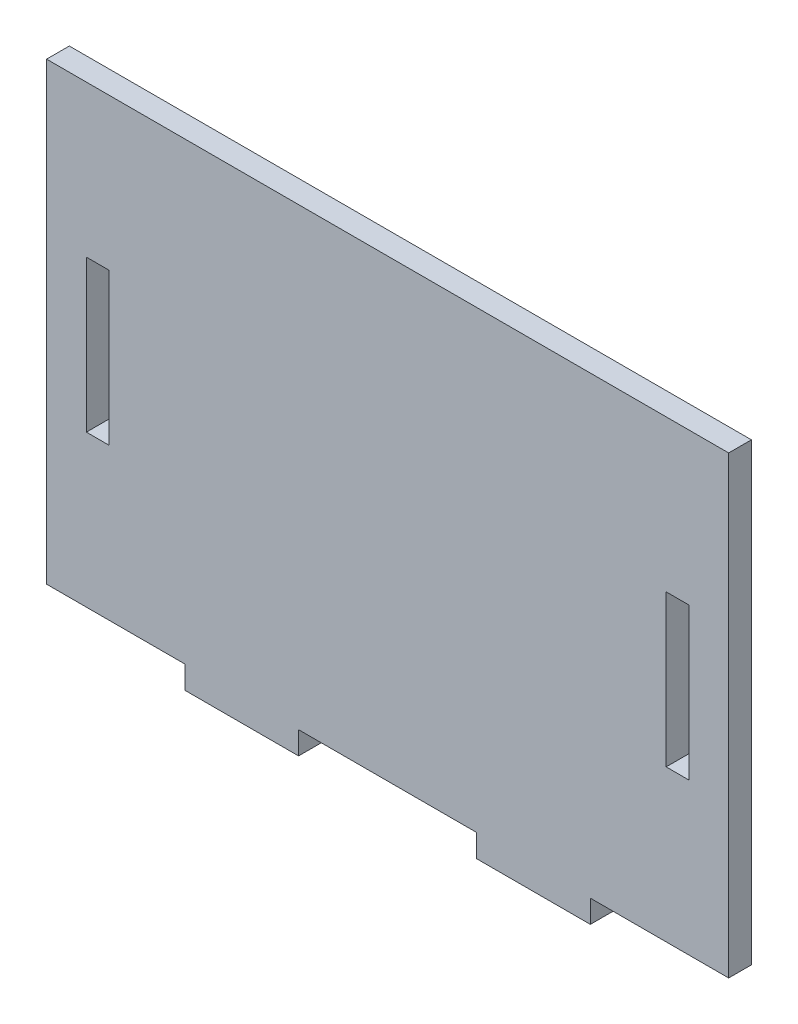
ISO-10303-21;
HEADER;
FILE_DESCRIPTION(('STEP AP214'),'2;1');
FILE_NAME('part.step','',(''),(''),'','','');
FILE_SCHEMA(('AUTOMOTIVE_DESIGN { 1 0 10303 214 1 1 1 1 }'));
ENDSEC;
DATA;
#1=APPLICATION_CONTEXT('core data for automotive mechanical design processes');
#2=APPLICATION_PROTOCOL_DEFINITION('international standard','automotive_design',2000,#1);
#3=PRODUCT_CONTEXT('',#1,'mechanical');
#4=PRODUCT('Part','Part','',(#3));
#5=PRODUCT_RELATED_PRODUCT_CATEGORY('part','',(#4));
#6=PRODUCT_DEFINITION_FORMATION('','',#4);
#7=PRODUCT_DEFINITION_CONTEXT('part definition',#1,'design');
#8=PRODUCT_DEFINITION('design','',#6,#7);
#9=PRODUCT_DEFINITION_SHAPE('','',#8);
#10=(LENGTH_UNIT() NAMED_UNIT(*) SI_UNIT(.MILLI.,.METRE.));
#11=(NAMED_UNIT(*) PLANE_ANGLE_UNIT() SI_UNIT($,.RADIAN.));
#12=(NAMED_UNIT(*) SI_UNIT($,.STERADIAN.) SOLID_ANGLE_UNIT());
#13=UNCERTAINTY_MEASURE_WITH_UNIT(LENGTH_MEASURE(1.E-05),#10,'distance_accuracy_value','');
#14=(GEOMETRIC_REPRESENTATION_CONTEXT(3) GLOBAL_UNCERTAINTY_ASSIGNED_CONTEXT((#13)) GLOBAL_UNIT_ASSIGNED_CONTEXT((#10,
#11,#12)) REPRESENTATION_CONTEXT('',''));
#15=CARTESIAN_POINT('',(0.,0.,0.));
#16=DIRECTION('',(0.,0.,1.));
#17=DIRECTION('',(1.,0.,0.));
#18=AXIS2_PLACEMENT_3D('',#15,#16,#17);
#19=CARTESIAN_POINT('',(0.,40.,3.));
#20=DIRECTION('',(0.,-1.,0.));
#21=DIRECTION('',(0.,0.,-1.));
#22=AXIS2_PLACEMENT_3D('',#19,#20,#21);
#23=PLANE('',#22);
#24=DIRECTION('',(-1.,0.,0.));
#25=VECTOR('',#24,1.);
#26=CARTESIAN_POINT('',(0.,40.,0.));
#27=LINE('',#26,#25);
#28=CARTESIAN_POINT('',(84.75,40.,0.));
#29=VERTEX_POINT('',#28);
#30=CARTESIAN_POINT('',(81.75,40.,0.));
#31=VERTEX_POINT('',#30);
#32=EDGE_CURVE('E341',#29,#31,#27,.T.);
#33=ORIENTED_EDGE('',*,*,#32,.F.);
#34=DIRECTION('',(0.,0.,-1.));
#35=VECTOR('',#34,1.);
#36=CARTESIAN_POINT('',(84.75,40.,3.));
#37=LINE('',#36,#35);
#38=CARTESIAN_POINT('',(84.75,40.,3.));
#39=VERTEX_POINT('',#38);
#40=EDGE_CURVE('E12',#39,#29,#37,.T.);
#41=ORIENTED_EDGE('',*,*,#40,.F.);
#42=DIRECTION('',(-1.,0.,0.));
#43=VECTOR('',#42,1.);
#44=CARTESIAN_POINT('',(0.,40.,3.));
#45=LINE('',#44,#43);
#46=CARTESIAN_POINT('',(81.75,40.,3.));
#47=VERTEX_POINT('',#46);
#48=EDGE_CURVE('E206',#39,#47,#45,.T.);
#49=ORIENTED_EDGE('',*,*,#48,.T.);
#50=DIRECTION('',(0.,0.,-1.));
#51=VECTOR('',#50,1.);
#52=CARTESIAN_POINT('',(81.75,40.,3.));
#53=LINE('',#52,#51);
#54=EDGE_CURVE('E66',#47,#31,#53,.T.);
#55=ORIENTED_EDGE('',*,*,#54,.T.);
#56=EDGE_LOOP('',(#33,#41,#49,#55));
#57=FACE_BOUND('',#56,.T.);
#58=ADVANCED_FACE('F46',(#57),#23,.T.);
#59=CARTESIAN_POINT('',(84.75,0.,3.));
#60=DIRECTION('',(1.,0.,0.));
#61=DIRECTION('',(0.,1.,0.));
#62=AXIS2_PLACEMENT_3D('',#59,#60,#61);
#63=PLANE('',#62);
#64=DIRECTION('',(0.,-1.,0.));
#65=VECTOR('',#64,1.);
#66=CARTESIAN_POINT('',(84.75,0.,0.));
#67=LINE('',#66,#65);
#68=CARTESIAN_POINT('',(84.75,20.,0.));
#69=VERTEX_POINT('',#68);
#70=EDGE_CURVE('E212',#29,#69,#67,.T.);
#71=ORIENTED_EDGE('',*,*,#70,.T.);
#72=DIRECTION('',(0.,0.,-1.));
#73=VECTOR('',#72,1.);
#74=CARTESIAN_POINT('',(84.75,20.,3.));
#75=LINE('',#74,#73);
#76=CARTESIAN_POINT('',(84.75,20.,3.));
#77=VERTEX_POINT('',#76);
#78=EDGE_CURVE('E57',#77,#69,#75,.T.);
#79=ORIENTED_EDGE('',*,*,#78,.F.);
#80=DIRECTION('',(0.,-1.,0.));
#81=VECTOR('',#80,1.);
#82=CARTESIAN_POINT('',(84.75,0.,3.));
#83=LINE('',#82,#81);
#84=EDGE_CURVE('E201',#39,#77,#83,.T.);
#85=ORIENTED_EDGE('',*,*,#84,.F.);
#86=ORIENTED_EDGE('',*,*,#40,.T.);
#87=EDGE_LOOP('',(#71,#79,#85,#86));
#88=FACE_BOUND('',#87,.T.);
#89=ADVANCED_FACE('F210',(#88),#63,.F.);
#90=CARTESIAN_POINT('',(0.,20.,3.));
#91=DIRECTION('',(0.,-1.,0.));
#92=DIRECTION('',(0.,0.,-1.));
#93=AXIS2_PLACEMENT_3D('',#90,#91,#92);
#94=PLANE('',#93);
#95=DIRECTION('',(-1.,0.,0.));
#96=VECTOR('',#95,1.);
#97=CARTESIAN_POINT('',(0.,20.,0.));
#98=LINE('',#97,#96);
#99=CARTESIAN_POINT('',(81.75,20.,0.));
#100=VERTEX_POINT('',#99);
#101=EDGE_CURVE('E346',#69,#100,#98,.T.);
#102=ORIENTED_EDGE('',*,*,#101,.T.);
#103=DIRECTION('',(0.,0.,-1.));
#104=VECTOR('',#103,1.);
#105=CARTESIAN_POINT('',(81.75,20.,3.));
#106=LINE('',#105,#104);
#107=CARTESIAN_POINT('',(81.75,20.,3.));
#108=VERTEX_POINT('',#107);
#109=EDGE_CURVE('E128',#108,#100,#106,.T.);
#110=ORIENTED_EDGE('',*,*,#109,.F.);
#111=DIRECTION('',(-1.,0.,0.));
#112=VECTOR('',#111,1.);
#113=CARTESIAN_POINT('',(0.,20.,3.));
#114=LINE('',#113,#112);
#115=EDGE_CURVE('E192',#77,#108,#114,.T.);
#116=ORIENTED_EDGE('',*,*,#115,.F.);
#117=ORIENTED_EDGE('',*,*,#78,.T.);
#118=EDGE_LOOP('',(#102,#110,#116,#117));
#119=FACE_BOUND('',#118,.T.);
#120=ADVANCED_FACE('F194',(#119),#94,.F.);
#121=CARTESIAN_POINT('',(0.,40.,3.));
#122=DIRECTION('',(0.,1.,0.));
#123=DIRECTION('',(0.,0.,1.));
#124=AXIS2_PLACEMENT_3D('',#121,#122,#123);
#125=PLANE('',#124);
#126=DIRECTION('',(1.,0.,0.));
#127=VECTOR('',#126,1.);
#128=CARTESIAN_POINT('',(0.,40.,0.));
#129=LINE('',#128,#127);
#130=CARTESIAN_POINT('',(5.25,40.,0.));
#131=VERTEX_POINT('',#130);
#132=CARTESIAN_POINT('',(8.25,40.,0.));
#133=VERTEX_POINT('',#132);
#134=EDGE_CURVE('E325',#131,#133,#129,.T.);
#135=ORIENTED_EDGE('',*,*,#134,.T.);
#136=DIRECTION('',(0.,0.,-1.));
#137=VECTOR('',#136,1.);
#138=CARTESIAN_POINT('',(8.25,40.,3.));
#139=LINE('',#138,#137);
#140=CARTESIAN_POINT('',(8.25,40.,3.));
#141=VERTEX_POINT('',#140);
#142=EDGE_CURVE('E228',#141,#133,#139,.T.);
#143=ORIENTED_EDGE('',*,*,#142,.F.);
#144=DIRECTION('',(1.,0.,0.));
#145=VECTOR('',#144,1.);
#146=CARTESIAN_POINT('',(0.,40.,3.));
#147=LINE('',#146,#145);
#148=CARTESIAN_POINT('',(5.25,40.,3.));
#149=VERTEX_POINT('',#148);
#150=EDGE_CURVE('E417',#149,#141,#147,.T.);
#151=ORIENTED_EDGE('',*,*,#150,.F.);
#152=DIRECTION('',(0.,0.,-1.));
#153=VECTOR('',#152,1.);
#154=CARTESIAN_POINT('',(5.25,40.,3.));
#155=LINE('',#154,#153);
#156=EDGE_CURVE('E219',#149,#131,#155,.T.);
#157=ORIENTED_EDGE('',*,*,#156,.T.);
#158=EDGE_LOOP('',(#135,#143,#151,#157));
#159=FACE_BOUND('',#158,.T.);
#160=ADVANCED_FACE('F477',(#159),#125,.F.);
#161=CARTESIAN_POINT('',(8.25,0.,3.));
#162=DIRECTION('',(1.,0.,0.));
#163=DIRECTION('',(0.,0.,-1.));
#164=AXIS2_PLACEMENT_3D('',#161,#162,#163);
#165=PLANE('',#164);
#166=DIRECTION('',(0.,-1.,0.));
#167=VECTOR('',#166,1.);
#168=CARTESIAN_POINT('',(8.25,0.,0.));
#169=LINE('',#168,#167);
#170=CARTESIAN_POINT('',(8.25,20.,0.));
#171=VERTEX_POINT('',#170);
#172=EDGE_CURVE('E329',#133,#171,#169,.T.);
#173=ORIENTED_EDGE('',*,*,#172,.T.);
#174=DIRECTION('',(0.,0.,-1.));
#175=VECTOR('',#174,1.);
#176=CARTESIAN_POINT('',(8.25,20.,3.));
#177=LINE('',#176,#175);
#178=CARTESIAN_POINT('',(8.25,20.,3.));
#179=VERTEX_POINT('',#178);
#180=EDGE_CURVE('E225',#179,#171,#177,.T.);
#181=ORIENTED_EDGE('',*,*,#180,.F.);
#182=DIRECTION('',(0.,-1.,0.));
#183=VECTOR('',#182,1.);
#184=CARTESIAN_POINT('',(8.25,0.,3.));
#185=LINE('',#184,#183);
#186=EDGE_CURVE('E422',#141,#179,#185,.T.);
#187=ORIENTED_EDGE('',*,*,#186,.F.);
#188=ORIENTED_EDGE('',*,*,#142,.T.);
#189=EDGE_LOOP('',(#173,#181,#187,#188));
#190=FACE_BOUND('',#189,.T.);
#191=ADVANCED_FACE('F473',(#190),#165,.F.);
#192=CARTESIAN_POINT('',(0.,20.,3.));
#193=DIRECTION('',(0.,1.,0.));
#194=DIRECTION('',(0.,0.,1.));
#195=AXIS2_PLACEMENT_3D('',#192,#193,#194);
#196=PLANE('',#195);
#197=DIRECTION('',(1.,0.,0.));
#198=VECTOR('',#197,1.);
#199=CARTESIAN_POINT('',(0.,20.,0.));
#200=LINE('',#199,#198);
#201=CARTESIAN_POINT('',(5.25000000000001,20.,0.));
#202=VERTEX_POINT('',#201);
#203=EDGE_CURVE('E333',#202,#171,#200,.T.);
#204=ORIENTED_EDGE('',*,*,#203,.F.);
#205=DIRECTION('',(0.,0.,-1.));
#206=VECTOR('',#205,1.);
#207=CARTESIAN_POINT('',(5.25000000000001,20.,3.));
#208=LINE('',#207,#206);
#209=CARTESIAN_POINT('',(5.25000000000001,20.,3.));
#210=VERTEX_POINT('',#209);
#211=EDGE_CURVE('E222',#210,#202,#208,.T.);
#212=ORIENTED_EDGE('',*,*,#211,.F.);
#213=DIRECTION('',(1.,0.,0.));
#214=VECTOR('',#213,1.);
#215=CARTESIAN_POINT('',(0.,20.,3.));
#216=LINE('',#215,#214);
#217=EDGE_CURVE('E426',#210,#179,#216,.T.);
#218=ORIENTED_EDGE('',*,*,#217,.T.);
#219=ORIENTED_EDGE('',*,*,#180,.T.);
#220=EDGE_LOOP('',(#204,#212,#218,#219));
#221=FACE_BOUND('',#220,.T.);
#222=ADVANCED_FACE('F470',(#221),#196,.T.);
#223=CARTESIAN_POINT('',(0.,0.,3.));
#224=DIRECTION('',(0.,1.,0.));
#225=DIRECTION('',(0.,0.,1.));
#226=AXIS2_PLACEMENT_3D('',#223,#224,#225);
#227=PLANE('',#226);
#228=DIRECTION('',(1.,0.,0.));
#229=VECTOR('',#228,1.);
#230=CARTESIAN_POINT('',(0.,0.,0.));
#231=LINE('',#230,#229);
#232=CARTESIAN_POINT('',(0.,0.,0.));
#233=VERTEX_POINT('',#232);
#234=CARTESIAN_POINT('',(18.25,0.,0.));
#235=VERTEX_POINT('',#234);
#236=EDGE_CURVE('E278',#233,#235,#231,.T.);
#237=ORIENTED_EDGE('',*,*,#236,.T.);
#238=DIRECTION('',(0.,0.,-1.));
#239=VECTOR('',#238,1.);
#240=CARTESIAN_POINT('',(18.25,0.,3.));
#241=LINE('',#240,#239);
#242=CARTESIAN_POINT('',(18.25,0.,3.));
#243=VERTEX_POINT('',#242);
#244=EDGE_CURVE('E50',#243,#235,#241,.T.);
#245=ORIENTED_EDGE('',*,*,#244,.F.);
#246=DIRECTION('',(1.,0.,0.));
#247=VECTOR('',#246,1.);
#248=CARTESIAN_POINT('',(0.,0.,3.));
#249=LINE('',#248,#247);
#250=CARTESIAN_POINT('',(0.,0.,3.));
#251=VERTEX_POINT('',#250);
#252=EDGE_CURVE('E352',#251,#243,#249,.T.);
#253=ORIENTED_EDGE('',*,*,#252,.F.);
#254=DIRECTION('',(0.,0.,-1.));
#255=VECTOR('',#254,1.);
#256=CARTESIAN_POINT('',(0.,0.,3.));
#257=LINE('',#256,#255);
#258=EDGE_CURVE('E232',#251,#233,#257,.T.);
#259=ORIENTED_EDGE('',*,*,#258,.T.);
#260=EDGE_LOOP('',(#237,#245,#253,#259));
#261=FACE_BOUND('',#260,.T.);
#262=ADVANCED_FACE('F279',(#261),#227,.F.);
#263=CARTESIAN_POINT('',(18.25,0.,3.));
#264=DIRECTION('',(1.,0.,0.));
#265=DIRECTION('',(0.,0.,-1.));
#266=AXIS2_PLACEMENT_3D('',#263,#264,#265);
#267=PLANE('',#266);
#268=DIRECTION('',(0.,-1.,0.));
#269=VECTOR('',#268,1.);
#270=CARTESIAN_POINT('',(18.25,0.,0.));
#271=LINE('',#270,#269);
#272=CARTESIAN_POINT('',(18.25,-3.00000000000001,0.));
#273=VERTEX_POINT('',#272);
#274=EDGE_CURVE('E273',#235,#273,#271,.T.);
#275=ORIENTED_EDGE('',*,*,#274,.T.);
#276=DIRECTION('',(0.,0.,-1.));
#277=VECTOR('',#276,1.);
#278=CARTESIAN_POINT('',(18.25,-3.00000000000001,3.));
#279=LINE('',#278,#277);
#280=CARTESIAN_POINT('',(18.25,-3.00000000000001,3.));
#281=VERTEX_POINT('',#280);
#282=EDGE_CURVE('E264',#281,#273,#279,.T.);
#283=ORIENTED_EDGE('',*,*,#282,.F.);
#284=DIRECTION('',(0.,-1.,0.));
#285=VECTOR('',#284,1.);
#286=CARTESIAN_POINT('',(18.25,0.,3.));
#287=LINE('',#286,#285);
#288=EDGE_CURVE('E141',#243,#281,#287,.T.);
#289=ORIENTED_EDGE('',*,*,#288,.F.);
#290=ORIENTED_EDGE('',*,*,#244,.T.);
#291=EDGE_LOOP('',(#275,#283,#289,#290));
#292=FACE_BOUND('',#291,.T.);
#293=ADVANCED_FACE('F48',(#292),#267,.F.);
#294=CARTESIAN_POINT('',(0.,-3.00000000000001,3.));
#295=DIRECTION('',(0.,-1.,0.));
#296=DIRECTION('',(1.,0.,0.));
#297=AXIS2_PLACEMENT_3D('',#294,#295,#296);
#298=PLANE('',#297);
#299=DIRECTION('',(-1.,0.,0.));
#300=VECTOR('',#299,1.);
#301=CARTESIAN_POINT('',(0.,-3.00000000000001,0.));
#302=LINE('',#301,#300);
#303=CARTESIAN_POINT('',(33.25,-3.,0.));
#304=VERTEX_POINT('',#303);
#305=EDGE_CURVE('E288',#304,#273,#302,.T.);
#306=ORIENTED_EDGE('',*,*,#305,.F.);
#307=DIRECTION('',(0.,0.,-1.));
#308=VECTOR('',#307,1.);
#309=CARTESIAN_POINT('',(33.25,-3.,3.));
#310=LINE('',#309,#308);
#311=CARTESIAN_POINT('',(33.25,-3.,3.));
#312=VERTEX_POINT('',#311);
#313=EDGE_CURVE('E262',#312,#304,#310,.T.);
#314=ORIENTED_EDGE('',*,*,#313,.F.);
#315=DIRECTION('',(-1.,0.,0.));
#316=VECTOR('',#315,1.);
#317=CARTESIAN_POINT('',(0.,-3.00000000000001,3.));
#318=LINE('',#317,#316);
#319=EDGE_CURVE('E362',#312,#281,#318,.T.);
#320=ORIENTED_EDGE('',*,*,#319,.T.);
#321=ORIENTED_EDGE('',*,*,#282,.T.);
#322=EDGE_LOOP('',(#306,#314,#320,#321));
#323=FACE_BOUND('',#322,.T.);
#324=ADVANCED_FACE('F508',(#323),#298,.T.);
#325=CARTESIAN_POINT('',(33.25,0.,3.));
#326=DIRECTION('',(1.,0.,0.));
#327=DIRECTION('',(0.,0.,-1.));
#328=AXIS2_PLACEMENT_3D('',#325,#326,#327);
#329=PLANE('',#328);
#330=DIRECTION('',(0.,-1.,0.));
#331=VECTOR('',#330,1.);
#332=CARTESIAN_POINT('',(33.25,0.,0.));
#333=LINE('',#332,#331);
#334=CARTESIAN_POINT('',(33.25,0.,0.));
#335=VERTEX_POINT('',#334);
#336=EDGE_CURVE('E295',#335,#304,#333,.T.);
#337=ORIENTED_EDGE('',*,*,#336,.F.);
#338=DIRECTION('',(0.,0.,-1.));
#339=VECTOR('',#338,1.);
#340=CARTESIAN_POINT('',(33.25,0.,3.));
#341=LINE('',#340,#339);
#342=CARTESIAN_POINT('',(33.25,0.,3.));
#343=VERTEX_POINT('',#342);
#344=EDGE_CURVE('E259',#343,#335,#341,.T.);
#345=ORIENTED_EDGE('',*,*,#344,.F.);
#346=DIRECTION('',(0.,-1.,0.));
#347=VECTOR('',#346,1.);
#348=CARTESIAN_POINT('',(33.25,0.,3.));
#349=LINE('',#348,#347);
#350=EDGE_CURVE('E370',#343,#312,#349,.T.);
#351=ORIENTED_EDGE('',*,*,#350,.T.);
#352=ORIENTED_EDGE('',*,*,#313,.T.);
#353=EDGE_LOOP('',(#337,#345,#351,#352));
#354=FACE_BOUND('',#353,.T.);
#355=ADVANCED_FACE('F506',(#354),#329,.T.);
#356=CARTESIAN_POINT('',(56.75,0.,0.));
#357=VERTEX_POINT('',#356);
#358=EDGE_CURVE('E286',#335,#357,#231,.T.);
#359=ORIENTED_EDGE('',*,*,#358,.T.);
#360=DIRECTION('',(0.,0.,-1.));
#361=VECTOR('',#360,1.);
#362=CARTESIAN_POINT('',(56.75,0.,3.));
#363=LINE('',#362,#361);
#364=CARTESIAN_POINT('',(56.75,0.,3.));
#365=VERTEX_POINT('',#364);
#366=EDGE_CURVE('E255',#365,#357,#363,.T.);
#367=ORIENTED_EDGE('',*,*,#366,.F.);
#368=EDGE_CURVE('E358',#343,#365,#249,.T.);
#369=ORIENTED_EDGE('',*,*,#368,.F.);
#370=ORIENTED_EDGE('',*,*,#344,.T.);
#371=EDGE_LOOP('',(#359,#367,#369,#370));
#372=FACE_BOUND('',#371,.T.);
#373=ADVANCED_FACE('F494',(#372),#227,.F.);
#374=CARTESIAN_POINT('',(56.75,0.,3.));
#375=DIRECTION('',(1.,0.,0.));
#376=DIRECTION('',(0.,0.,-1.));
#377=AXIS2_PLACEMENT_3D('',#374,#375,#376);
#378=PLANE('',#377);
#379=DIRECTION('',(0.,-1.,0.));
#380=VECTOR('',#379,1.);
#381=CARTESIAN_POINT('',(56.75,0.,0.));
#382=LINE('',#381,#380);
#383=CARTESIAN_POINT('',(56.75,-3.,0.));
#384=VERTEX_POINT('',#383);
#385=EDGE_CURVE('E294',#357,#384,#382,.T.);
#386=ORIENTED_EDGE('',*,*,#385,.T.);
#387=DIRECTION('',(0.,0.,-1.));
#388=VECTOR('',#387,1.);
#389=CARTESIAN_POINT('',(56.75,-3.,3.));
#390=LINE('',#389,#388);
#391=CARTESIAN_POINT('',(56.75,-3.,3.));
#392=VERTEX_POINT('',#391);
#393=EDGE_CURVE('E251',#392,#384,#390,.T.);
#394=ORIENTED_EDGE('',*,*,#393,.F.);
#395=DIRECTION('',(0.,-1.,0.));
#396=VECTOR('',#395,1.);
#397=CARTESIAN_POINT('',(56.75,0.,3.));
#398=LINE('',#397,#396);
#399=EDGE_CURVE('E369',#365,#392,#398,.T.);
#400=ORIENTED_EDGE('',*,*,#399,.F.);
#401=ORIENTED_EDGE('',*,*,#366,.T.);
#402=EDGE_LOOP('',(#386,#394,#400,#401));
#403=FACE_BOUND('',#402,.T.);
#404=ADVANCED_FACE('F501',(#403),#378,.F.);
#405=CARTESIAN_POINT('',(0.,-3.,3.));
#406=DIRECTION('',(0.,1.,0.));
#407=DIRECTION('',(0.,0.,1.));
#408=AXIS2_PLACEMENT_3D('',#405,#406,#407);
#409=PLANE('',#408);
#410=DIRECTION('',(1.,0.,0.));
#411=VECTOR('',#410,1.);
#412=CARTESIAN_POINT('',(0.,-3.,0.));
#413=LINE('',#412,#411);
#414=CARTESIAN_POINT('',(71.75,-3.,0.));
#415=VERTEX_POINT('',#414);
#416=EDGE_CURVE('E301',#384,#415,#413,.T.);
#417=ORIENTED_EDGE('',*,*,#416,.T.);
#418=DIRECTION('',(0.,0.,-1.));
#419=VECTOR('',#418,1.);
#420=CARTESIAN_POINT('',(71.75,-3.,3.));
#421=LINE('',#420,#419);
#422=CARTESIAN_POINT('',(71.75,-3.,3.));
#423=VERTEX_POINT('',#422);
#424=EDGE_CURVE('E248',#423,#415,#421,.T.);
#425=ORIENTED_EDGE('',*,*,#424,.F.);
#426=DIRECTION('',(1.,0.,0.));
#427=VECTOR('',#426,1.);
#428=CARTESIAN_POINT('',(0.,-3.,3.));
#429=LINE('',#428,#427);
#430=EDGE_CURVE('E375',#392,#423,#429,.T.);
#431=ORIENTED_EDGE('',*,*,#430,.F.);
#432=ORIENTED_EDGE('',*,*,#393,.T.);
#433=EDGE_LOOP('',(#417,#425,#431,#432));
#434=FACE_BOUND('',#433,.T.);
#435=ADVANCED_FACE('F497',(#434),#409,.F.);
#436=CARTESIAN_POINT('',(71.75,0.,3.));
#437=DIRECTION('',(1.,0.,0.));
#438=DIRECTION('',(0.,0.,-1.));
#439=AXIS2_PLACEMENT_3D('',#436,#437,#438);
#440=PLANE('',#439);
#441=DIRECTION('',(0.,-1.,0.));
#442=VECTOR('',#441,1.);
#443=CARTESIAN_POINT('',(71.75,0.,0.));
#444=LINE('',#443,#442);
#445=CARTESIAN_POINT('',(71.75,0.,0.));
#446=VERTEX_POINT('',#445);
#447=EDGE_CURVE('E292',#446,#415,#444,.T.);
#448=ORIENTED_EDGE('',*,*,#447,.F.);
#449=DIRECTION('',(0.,0.,-1.));
#450=VECTOR('',#449,1.);
#451=CARTESIAN_POINT('',(71.75,0.,3.));
#452=LINE('',#451,#450);
#453=CARTESIAN_POINT('',(71.75,0.,3.));
#454=VERTEX_POINT('',#453);
#455=EDGE_CURVE('E245',#454,#446,#452,.T.);
#456=ORIENTED_EDGE('',*,*,#455,.F.);
#457=DIRECTION('',(0.,-1.,0.));
#458=VECTOR('',#457,1.);
#459=CARTESIAN_POINT('',(71.75,0.,3.));
#460=LINE('',#459,#458);
#461=EDGE_CURVE('E367',#454,#423,#460,.T.);
#462=ORIENTED_EDGE('',*,*,#461,.T.);
#463=ORIENTED_EDGE('',*,*,#424,.T.);
#464=EDGE_LOOP('',(#448,#456,#462,#463));
#465=FACE_BOUND('',#464,.T.);
#466=ADVANCED_FACE('F492',(#465),#440,.T.);
#467=CARTESIAN_POINT('',(90.,0.,0.));
#468=VERTEX_POINT('',#467);
#469=EDGE_CURVE('E285',#446,#468,#231,.T.);
#470=ORIENTED_EDGE('',*,*,#469,.T.);
#471=DIRECTION('',(0.,0.,-1.));
#472=VECTOR('',#471,1.);
#473=CARTESIAN_POINT('',(90.,0.,3.));
#474=LINE('',#473,#472);
#475=CARTESIAN_POINT('',(90.,0.,3.));
#476=VERTEX_POINT('',#475);
#477=EDGE_CURVE('E241',#476,#468,#474,.T.);
#478=ORIENTED_EDGE('',*,*,#477,.F.);
#479=EDGE_CURVE('E357',#454,#476,#249,.T.);
#480=ORIENTED_EDGE('',*,*,#479,.F.);
#481=ORIENTED_EDGE('',*,*,#455,.T.);
#482=EDGE_LOOP('',(#470,#478,#480,#481));
#483=FACE_BOUND('',#482,.T.);
#484=ADVANCED_FACE('F488',(#483),#227,.F.);
#485=CARTESIAN_POINT('',(90.,0.,3.));
#486=DIRECTION('',(-1.,0.,0.));
#487=DIRECTION('',(0.,0.,1.));
#488=AXIS2_PLACEMENT_3D('',#485,#486,#487);
#489=PLANE('',#488);
#490=DIRECTION('',(0.,1.,0.));
#491=VECTOR('',#490,1.);
#492=CARTESIAN_POINT('',(90.,0.,0.));
#493=LINE('',#492,#491);
#494=CARTESIAN_POINT('',(90.,60.,0.));
#495=VERTEX_POINT('',#494);
#496=EDGE_CURVE('E291',#468,#495,#493,.T.);
#497=ORIENTED_EDGE('',*,*,#496,.T.);
#498=DIRECTION('',(0.,0.,-1.));
#499=VECTOR('',#498,1.);
#500=CARTESIAN_POINT('',(90.,60.,3.));
#501=LINE('',#500,#499);
#502=CARTESIAN_POINT('',(90.,60.,3.));
#503=VERTEX_POINT('',#502);
#504=EDGE_CURVE('E238',#503,#495,#501,.T.);
#505=ORIENTED_EDGE('',*,*,#504,.F.);
#506=DIRECTION('',(0.,1.,0.));
#507=VECTOR('',#506,1.);
#508=CARTESIAN_POINT('',(90.,0.,3.));
#509=LINE('',#508,#507);
#510=EDGE_CURVE('E366',#476,#503,#509,.T.);
#511=ORIENTED_EDGE('',*,*,#510,.F.);
#512=ORIENTED_EDGE('',*,*,#477,.T.);
#513=EDGE_LOOP('',(#497,#505,#511,#512));
#514=FACE_BOUND('',#513,.T.);
#515=ADVANCED_FACE('F484',(#514),#489,.F.);
#516=CARTESIAN_POINT('',(0.,60.,3.));
#517=DIRECTION('',(0.,1.,0.));
#518=DIRECTION('',(0.,0.,1.));
#519=AXIS2_PLACEMENT_3D('',#516,#517,#518);
#520=PLANE('',#519);
#521=DIRECTION('',(1.,0.,0.));
#522=VECTOR('',#521,1.);
#523=CARTESIAN_POINT('',(0.,60.,0.));
#524=LINE('',#523,#522);
#525=CARTESIAN_POINT('',(0.,60.,0.));
#526=VERTEX_POINT('',#525);
#527=EDGE_CURVE('E318',#526,#495,#524,.T.);
#528=ORIENTED_EDGE('',*,*,#527,.F.);
#529=DIRECTION('',(0.,0.,-1.));
#530=VECTOR('',#529,1.);
#531=CARTESIAN_POINT('',(0.,60.,3.));
#532=LINE('',#531,#530);
#533=CARTESIAN_POINT('',(0.,60.,3.));
#534=VERTEX_POINT('',#533);
#535=EDGE_CURVE('E235',#534,#526,#532,.T.);
#536=ORIENTED_EDGE('',*,*,#535,.F.);
#537=DIRECTION('',(1.,0.,0.));
#538=VECTOR('',#537,1.);
#539=CARTESIAN_POINT('',(0.,60.,3.));
#540=LINE('',#539,#538);
#541=EDGE_CURVE('E404',#534,#503,#540,.T.);
#542=ORIENTED_EDGE('',*,*,#541,.T.);
#543=ORIENTED_EDGE('',*,*,#504,.T.);
#544=EDGE_LOOP('',(#528,#536,#542,#543));
#545=FACE_BOUND('',#544,.T.);
#546=ADVANCED_FACE('F468',(#545),#520,.T.);
#547=CARTESIAN_POINT('',(5.25000000000001,0.,3.));
#548=DIRECTION('',(1.,0.,0.));
#549=DIRECTION('',(0.,1.,0.));
#550=AXIS2_PLACEMENT_3D('',#547,#548,#549);
#551=PLANE('',#550);
#552=DIRECTION('',(0.,-1.,0.));
#553=VECTOR('',#552,1.);
#554=CARTESIAN_POINT('',(5.25000000000001,0.,0.));
#555=LINE('',#554,#553);
#556=EDGE_CURVE('E337',#131,#202,#555,.T.);
#557=ORIENTED_EDGE('',*,*,#556,.F.);
#558=ORIENTED_EDGE('',*,*,#156,.F.);
#559=DIRECTION('',(0.,-1.,0.));
#560=VECTOR('',#559,1.);
#561=CARTESIAN_POINT('',(5.25000000000001,0.,3.));
#562=LINE('',#561,#560);
#563=EDGE_CURVE('E434',#149,#210,#562,.T.);
#564=ORIENTED_EDGE('',*,*,#563,.T.);
#565=ORIENTED_EDGE('',*,*,#211,.T.);
#566=EDGE_LOOP('',(#557,#558,#564,#565));
#567=FACE_BOUND('',#566,.T.);
#568=ADVANCED_FACE('F454',(#567),#551,.T.);
#569=CARTESIAN_POINT('',(0.,0.,3.));
#570=DIRECTION('',(-1.,0.,0.));
#571=DIRECTION('',(0.,0.,1.));
#572=AXIS2_PLACEMENT_3D('',#569,#570,#571);
#573=PLANE('',#572);
#574=DIRECTION('',(0.,1.,0.));
#575=VECTOR('',#574,1.);
#576=CARTESIAN_POINT('',(0.,0.,0.));
#577=LINE('',#576,#575);
#578=EDGE_CURVE('E322',#233,#526,#577,.T.);
#579=ORIENTED_EDGE('',*,*,#578,.F.);
#580=ORIENTED_EDGE('',*,*,#258,.F.);
#581=DIRECTION('',(0.,1.,0.));
#582=VECTOR('',#581,1.);
#583=CARTESIAN_POINT('',(0.,0.,3.));
#584=LINE('',#583,#582);
#585=EDGE_CURVE('E413',#251,#534,#584,.T.);
#586=ORIENTED_EDGE('',*,*,#585,.T.);
#587=ORIENTED_EDGE('',*,*,#535,.T.);
#588=EDGE_LOOP('',(#579,#580,#586,#587));
#589=FACE_BOUND('',#588,.T.);
#590=ADVANCED_FACE('F446',(#589),#573,.T.);
#591=CARTESIAN_POINT('',(81.75,0.,3.));
#592=DIRECTION('',(1.,0.,0.));
#593=DIRECTION('',(0.,1.,0.));
#594=AXIS2_PLACEMENT_3D('',#591,#592,#593);
#595=PLANE('',#594);
#596=DIRECTION('',(0.,-1.,0.));
#597=VECTOR('',#596,1.);
#598=CARTESIAN_POINT('',(81.75,0.,0.));
#599=LINE('',#598,#597);
#600=EDGE_CURVE('E349',#31,#100,#599,.T.);
#601=ORIENTED_EDGE('',*,*,#600,.F.);
#602=ORIENTED_EDGE('',*,*,#54,.F.);
#603=DIRECTION('',(0.,-1.,0.));
#604=VECTOR('',#603,1.);
#605=CARTESIAN_POINT('',(81.75,0.,3.));
#606=LINE('',#605,#604);
#607=EDGE_CURVE('E200',#47,#108,#606,.T.);
#608=ORIENTED_EDGE('',*,*,#607,.T.);
#609=ORIENTED_EDGE('',*,*,#109,.T.);
#610=EDGE_LOOP('',(#601,#602,#608,#609));
#611=FACE_BOUND('',#610,.T.);
#612=ADVANCED_FACE('F444',(#611),#595,.T.);
#613=CARTESIAN_POINT('',(0.,0.,3.));
#614=DIRECTION('',(0.,0.,1.));
#615=DIRECTION('',(1.,0.,0.));
#616=AXIS2_PLACEMENT_3D('',#613,#614,#615);
#617=PLANE('',#616);
#618=ORIENTED_EDGE('',*,*,#252,.T.);
#619=ORIENTED_EDGE('',*,*,#288,.T.);
#620=ORIENTED_EDGE('',*,*,#319,.F.);
#621=ORIENTED_EDGE('',*,*,#350,.F.);
#622=ORIENTED_EDGE('',*,*,#368,.T.);
#623=ORIENTED_EDGE('',*,*,#399,.T.);
#624=ORIENTED_EDGE('',*,*,#430,.T.);
#625=ORIENTED_EDGE('',*,*,#461,.F.);
#626=ORIENTED_EDGE('',*,*,#479,.T.);
#627=ORIENTED_EDGE('',*,*,#510,.T.);
#628=ORIENTED_EDGE('',*,*,#541,.F.);
#629=ORIENTED_EDGE('',*,*,#585,.F.);
#630=EDGE_LOOP('',(#618,#619,#620,#621,#622,#623,#624,#625,#626,#627,#628,#629));
#631=FACE_BOUND('',#630,.T.);
#632=ORIENTED_EDGE('',*,*,#150,.T.);
#633=ORIENTED_EDGE('',*,*,#186,.T.);
#634=ORIENTED_EDGE('',*,*,#217,.F.);
#635=ORIENTED_EDGE('',*,*,#563,.F.);
#636=EDGE_LOOP('',(#632,#633,#634,#635));
#637=FACE_BOUND('',#636,.T.);
#638=ORIENTED_EDGE('',*,*,#48,.F.);
#639=ORIENTED_EDGE('',*,*,#84,.T.);
#640=ORIENTED_EDGE('',*,*,#115,.T.);
#641=ORIENTED_EDGE('',*,*,#607,.F.);
#642=EDGE_LOOP('',(#638,#639,#640,#641));
#643=FACE_BOUND('',#642,.T.);
#644=ADVANCED_FACE('F205',(#631,#637,#643),#617,.T.);
#645=CARTESIAN_POINT('',(0.,0.,0.));
#646=DIRECTION('',(0.,0.,1.));
#647=DIRECTION('',(1.,0.,0.));
#648=AXIS2_PLACEMENT_3D('',#645,#646,#647);
#649=PLANE('',#648);
#650=ORIENTED_EDGE('',*,*,#236,.F.);
#651=ORIENTED_EDGE('',*,*,#578,.T.);
#652=ORIENTED_EDGE('',*,*,#527,.T.);
#653=ORIENTED_EDGE('',*,*,#496,.F.);
#654=ORIENTED_EDGE('',*,*,#469,.F.);
#655=ORIENTED_EDGE('',*,*,#447,.T.);
#656=ORIENTED_EDGE('',*,*,#416,.F.);
#657=ORIENTED_EDGE('',*,*,#385,.F.);
#658=ORIENTED_EDGE('',*,*,#358,.F.);
#659=ORIENTED_EDGE('',*,*,#336,.T.);
#660=ORIENTED_EDGE('',*,*,#305,.T.);
#661=ORIENTED_EDGE('',*,*,#274,.F.);
#662=EDGE_LOOP('',(#650,#651,#652,#653,#654,#655,#656,#657,#658,#659,#660,#661));
#663=FACE_BOUND('',#662,.T.);
#664=ORIENTED_EDGE('',*,*,#134,.F.);
#665=ORIENTED_EDGE('',*,*,#556,.T.);
#666=ORIENTED_EDGE('',*,*,#203,.T.);
#667=ORIENTED_EDGE('',*,*,#172,.F.);
#668=EDGE_LOOP('',(#664,#665,#666,#667));
#669=FACE_BOUND('',#668,.T.);
#670=ORIENTED_EDGE('',*,*,#32,.T.);
#671=ORIENTED_EDGE('',*,*,#600,.T.);
#672=ORIENTED_EDGE('',*,*,#101,.F.);
#673=ORIENTED_EDGE('',*,*,#70,.F.);
#674=EDGE_LOOP('',(#670,#671,#672,#673));
#675=FACE_BOUND('',#674,.T.);
#676=ADVANCED_FACE('F452',(#663,#669,#675),#649,.F.);
#677=CLOSED_SHELL('',(#58,#89,#120,#160,#191,#222,#262,#293,#324,#355,#373,#404,#435,#466,#484,
#515,#546,#568,#590,#612,#644,#676));
#678=MANIFOLD_SOLID_BREP('B2',#677);
#679=ADVANCED_BREP_SHAPE_REPRESENTATION('',(#18,#678),#14);
#680=SHAPE_DEFINITION_REPRESENTATION(#9,#679);
ENDSEC;
END-ISO-10303-21;
